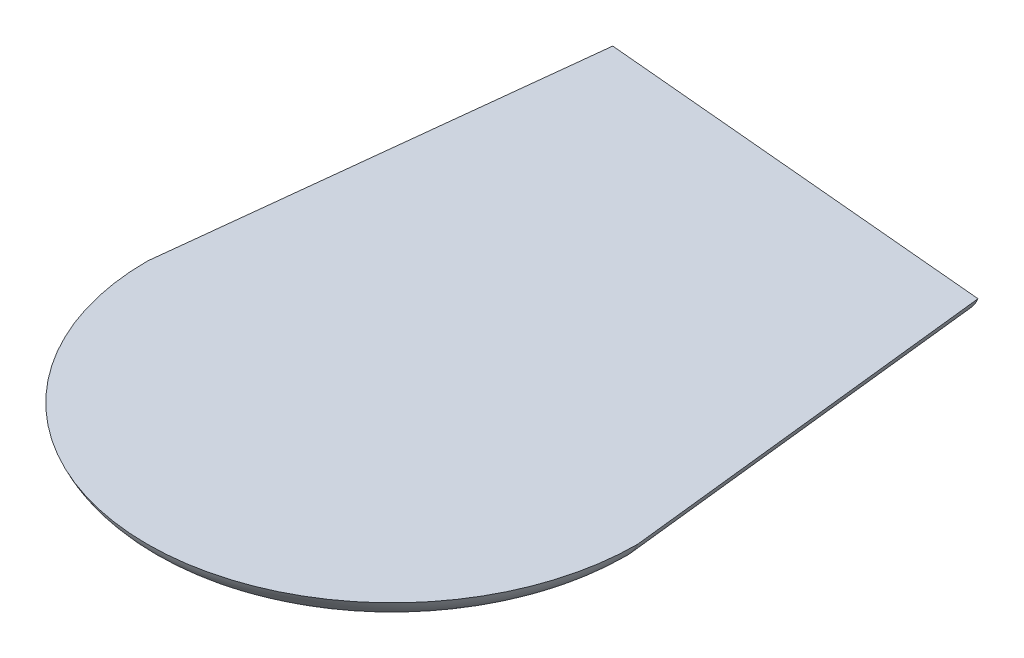
ISO-10303-21;
HEADER;
FILE_DESCRIPTION(('STEP AP214'),'2;1');
FILE_NAME('part.step','',(''),(''),'','','');
FILE_SCHEMA(('AUTOMOTIVE_DESIGN { 1 0 10303 214 1 1 1 1 }'));
ENDSEC;
DATA;
#1=APPLICATION_CONTEXT('core data for automotive mechanical design processes');
#2=APPLICATION_PROTOCOL_DEFINITION('international standard','automotive_design',2000,#1);
#3=PRODUCT_CONTEXT('',#1,'mechanical');
#4=PRODUCT('Part','Part','',(#3));
#5=PRODUCT_RELATED_PRODUCT_CATEGORY('part','',(#4));
#6=PRODUCT_DEFINITION_FORMATION('','',#4);
#7=PRODUCT_DEFINITION_CONTEXT('part definition',#1,'design');
#8=PRODUCT_DEFINITION('design','',#6,#7);
#9=PRODUCT_DEFINITION_SHAPE('','',#8);
#10=(LENGTH_UNIT() NAMED_UNIT(*) SI_UNIT(.MILLI.,.METRE.));
#11=(NAMED_UNIT(*) PLANE_ANGLE_UNIT() SI_UNIT($,.RADIAN.));
#12=(NAMED_UNIT(*) SI_UNIT($,.STERADIAN.) SOLID_ANGLE_UNIT());
#13=UNCERTAINTY_MEASURE_WITH_UNIT(LENGTH_MEASURE(1.E-05),#10,'distance_accuracy_value','');
#14=(GEOMETRIC_REPRESENTATION_CONTEXT(3) GLOBAL_UNCERTAINTY_ASSIGNED_CONTEXT((#13)) GLOBAL_UNIT_ASSIGNED_CONTEXT((#10,
#11,#12)) REPRESENTATION_CONTEXT('',''));
#15=CARTESIAN_POINT('',(0.,0.,0.));
#16=DIRECTION('',(0.,0.,1.));
#17=DIRECTION('',(1.,0.,0.));
#18=AXIS2_PLACEMENT_3D('',#15,#16,#17);
#19=CARTESIAN_POINT('',(4.23648736330622,-3.,-46.9807139742057));
#20=DIRECTION('',(-0.0898106216544804,0.,0.99595886071566));
#21=DIRECTION('',(0.99595886071566,0.,0.0898106216544804));
#22=AXIS2_PLACEMENT_3D('',#19,#20,#21);
#23=PLANE('',#22);
#24=DIRECTION('',(-0.99595886071566,0.,-0.0898106216544804));
#25=VECTOR('',#24,1.);
#26=CARTESIAN_POINT('',(4.23648736330622,-3.,-46.9807139742057));
#27=LINE('',#26,#25);
#28=CARTESIAN_POINT('',(-26.3780603527636,-3.,-49.7413817793752));
#29=VERTEX_POINT('',#28);
#30=CARTESIAN_POINT('',(-61.3628304151396,-3.,-52.8961345223583));
#31=VERTEX_POINT('',#30);
#32=EDGE_CURVE('E113',#29,#31,#27,.T.);
#33=ORIENTED_EDGE('',*,*,#32,.T.);
#34=CARTESIAN_POINT('',(-61.3628304151396,2.,-52.8961345223583));
#35=DIRECTION('',(0.0898106216544804,0.,-0.99595886071566));
#36=DIRECTION('',(-0.99595886071566,0.,-0.0898106216544804));
#37=AXIS2_PLACEMENT_3D('',#34,#35,#36);
#38=ELLIPSE('',#37,5.00105458418158,5.);
#39=CARTESIAN_POINT('',(-65.9278499198665,0.,-53.3077853000719));
#40=VERTEX_POINT('',#39);
#41=EDGE_CURVE('E60',#40,#31,#38,.F.);
#42=ORIENTED_EDGE('',*,*,#41,.F.);
#43=DIRECTION('',(-0.99595886071566,0.,-0.0898106216544804));
#44=VECTOR('',#43,1.);
#45=CARTESIAN_POINT('',(4.23648736330622,0.,-46.9807139742057));
#46=LINE('',#45,#44);
#47=CARTESIAN_POINT('',(-21.7207974794711,0.,-49.321412952994));
#48=VERTEX_POINT('',#47);
#49=EDGE_CURVE('E108',#48,#40,#46,.T.);
#50=ORIENTED_EDGE('',*,*,#49,.F.);
#51=CARTESIAN_POINT('',(-26.3780603527636,2.,-49.7413817793752));
#52=DIRECTION('',(0.0898106216544804,0.,-0.99595886071566));
#53=DIRECTION('',(-0.99595886071566,0.,-0.0898106216544804));
#54=AXIS2_PLACEMENT_3D('',#51,#52,#53);
#55=ELLIPSE('',#54,5.10210872442078,5.);
#56=EDGE_CURVE('E11',#29,#48,#55,.F.);
#57=ORIENTED_EDGE('',*,*,#56,.F.);
#58=EDGE_LOOP('',(#33,#42,#50,#57));
#59=FACE_BOUND('',#58,.T.);
#60=ADVANCED_FACE('F44',(#59),#23,.F.);
#61=CARTESIAN_POINT('',(0.,-3.,0.));
#62=DIRECTION('',(0.,-1.,0.));
#63=DIRECTION('',(0.,0.,1.));
#64=AXIS2_PLACEMENT_3D('',#61,#62,#63);
#65=PLANE('',#64);
#66=CARTESIAN_POINT('',(-44.0454082026318,-3.,-7.17046552061219));
#67=DIRECTION('',(0.,1.,0.));
#68=DIRECTION('',(0.,0.,1.));
#69=AXIS2_PLACEMENT_3D('',#66,#67,#68);
#70=CIRCLE('',#69,22.4174243050442);
#71=CARTESIAN_POINT('',(-66.461530220432,-3.,-6.92883324735814));
#72=VERTEX_POINT('',#71);
#73=CARTESIAN_POINT('',(-21.6292861848316,-3.,-6.92883324735813));
#74=VERTEX_POINT('',#73);
#75=EDGE_CURVE('E119',#72,#74,#70,.T.);
#76=ORIENTED_EDGE('',*,*,#75,.F.);
#77=DIRECTION('',(0.110244038447532,0.,-0.993904548730299));
#78=VECTOR('',#77,1.);
#79=CARTESIAN_POINT('',(-66.4907653745143,-3.,-6.66526386950875));
#80=LINE('',#79,#78);
#81=EDGE_CURVE('E96',#31,#72,#80,.F.);
#82=ORIENTED_EDGE('',*,*,#81,.F.);
#83=ORIENTED_EDGE('',*,*,#32,.F.);
#84=DIRECTION('',(0.110244038447532,0.,0.993904548730299));
#85=VECTOR('',#84,1.);
#86=CARTESIAN_POINT('',(-26.2754403075886,-3.,-48.8162113018905));
#87=LINE('',#86,#85);
#88=EDGE_CURVE('E124',#74,#29,#87,.F.);
#89=ORIENTED_EDGE('',*,*,#88,.F.);
#90=EDGE_LOOP('',(#76,#82,#83,#89));
#91=FACE_BOUND('',#90,.T.);
#92=ADVANCED_FACE('F141',(#91),#65,.T.);
#93=CARTESIAN_POINT('',(0.,0.,0.));
#94=DIRECTION('',(0.,-1.,0.));
#95=DIRECTION('',(0.,0.,1.));
#96=AXIS2_PLACEMENT_3D('',#93,#94,#95);
#97=PLANE('',#96);
#98=DIRECTION('',(-0.110244038447532,0.,0.993904548730299));
#99=VECTOR('',#98,1.);
#100=CARTESIAN_POINT('',(-70.967622829591,0.,-7.87173914210387));
#101=LINE('',#100,#99);
#102=CARTESIAN_POINT('',(-71.0454082026318,0.,-7.17046552061218));
#103=VERTEX_POINT('',#102);
#104=EDGE_CURVE('E94',#40,#103,#101,.T.);
#105=ORIENTED_EDGE('',*,*,#104,.T.);
#106=CARTESIAN_POINT('',(-44.0454082026318,0.,-7.17046552061219));
#107=DIRECTION('',(0.,1.,0.));
#108=DIRECTION('',(0.,0.,1.));
#109=AXIS2_PLACEMENT_3D('',#106,#107,#108);
#110=CIRCLE('',#109,27.);
#111=CARTESIAN_POINT('',(-17.0454082026318,0.,-7.17046552061219));
#112=VERTEX_POINT('',#111);
#113=EDGE_CURVE('E100',#103,#112,#110,.T.);
#114=ORIENTED_EDGE('',*,*,#113,.T.);
#115=DIRECTION('',(-0.110244038447532,0.,-0.993904548730299));
#116=VECTOR('',#115,1.);
#117=CARTESIAN_POINT('',(-16.0525599908042,0.,1.78055231065025));
#118=LINE('',#117,#116);
#119=EDGE_CURVE('E104',#112,#48,#118,.T.);
#120=ORIENTED_EDGE('',*,*,#119,.T.);
#121=ORIENTED_EDGE('',*,*,#49,.T.);
#122=EDGE_LOOP('',(#105,#114,#120,#121));
#123=FACE_BOUND('',#122,.T.);
#124=ADVANCED_FACE('F106',(#123),#97,.F.);
#125=CARTESIAN_POINT('',(-66.4129800014735,2.,-7.36653749100043));
#126=DIRECTION('',(-0.110244038447532,0.,0.993904548730299));
#127=DIRECTION('',(0.993904548730299,0.,0.110244038447532));
#128=AXIS2_PLACEMENT_3D('',#125,#126,#127);
#129=CYLINDRICAL_SURFACE('',#128,5.);
#130=ORIENTED_EDGE('',*,*,#41,.T.);
#131=ORIENTED_EDGE('',*,*,#81,.T.);
#132=CARTESIAN_POINT('',(-71.0454082026318,0.,-7.17046552061218));
#133=CARTESIAN_POINT('',(-70.9891632545754,-0.128911410572629,-7.1673558438904));
#134=CARTESIAN_POINT('',(-70.9274551335817,-0.255428588502961,-7.16394870861434));
#135=CARTESIAN_POINT('',(-70.7936175114508,-0.502799687587828,-7.15657422599523));
#136=CARTESIAN_POINT('',(-70.7214885719832,-0.623653913504012,-7.15260690884558));
#137=CARTESIAN_POINT('',(-70.567390343747,-0.858712956836937,-7.14415093749269));
#138=CARTESIAN_POINT('',(-70.4854316339903,-0.972924729817045,-7.13966284392659));
#139=CARTESIAN_POINT('',(-70.312203368848,-1.19403029017282,-7.13020209584261));
#140=CARTESIAN_POINT('',(-70.2209339307313,-1.30092416968931,-7.12522944742776));
#141=CARTESIAN_POINT('',(-70.0297148531681,-1.50665867667337,-7.11484227694856));
#142=CARTESIAN_POINT('',(-69.9297635476081,-1.60549775128007,-7.10942767008124));
#143=CARTESIAN_POINT('',(-69.7218721494841,-1.79443471057692,-7.09820277641206));
#144=CARTESIAN_POINT('',(-69.6139292909746,-1.88452954364142,-7.09239235267066));
#145=CARTESIAN_POINT('',(-69.390843920622,-2.0553110758346,-7.08042723733761));
#146=CARTESIAN_POINT('',(-69.2757007624269,-2.13599692847612,-7.07427251484442));
#147=CARTESIAN_POINT('',(-69.0390422423158,-2.28738300669751,-7.06167191816622));
#148=CARTESIAN_POINT('',(-68.9175268694161,-2.3580832150644,-7.05522604347934));
#149=CARTESIAN_POINT('',(-68.6687540490963,-2.48912371985861,-7.04208525356119));
#150=CARTESIAN_POINT('',(-68.5414862670528,-2.54944435206802,-7.0353898942343));
#151=CARTESIAN_POINT('',(-68.2823717329607,-2.65911969170678,-7.0218197791649));
#152=CARTESIAN_POINT('',(-68.1505265980881,-2.70847822735425,-7.01494508698975));
#153=CARTESIAN_POINT('',(-67.8832942266268,-2.79586407108927,-7.00107779067143));
#154=CARTESIAN_POINT('',(-67.7479108256271,-2.83390313733175,-6.99408531691108));
#155=CARTESIAN_POINT('',(-67.4744791830612,-2.89843962835979,-6.98003418507152));
#156=CARTESIAN_POINT('',(-67.3364321494718,-2.9249421622785,-6.97297555770719));
#157=CARTESIAN_POINT('',(-67.0823882473908,-2.96271149699411,-6.96005472194234));
#158=CARTESIAN_POINT('',(-66.9666585568858,-2.9758089228742,-6.95419438156215));
#159=CARTESIAN_POINT('',(-66.7346667509082,-2.99389470564459,-6.94250036028998));
#160=CARTESIAN_POINT('',(-66.6184053251805,-2.99889159497268,-6.93666665780918));
#161=CARTESIAN_POINT('',(-66.4886057213292,-2.9999451300382,-6.93018431123964));
#162=CARTESIAN_POINT('',(-66.4750677142916,-3.00000005399094,-6.92950857952413));
#163=CARTESIAN_POINT('',(-66.461530220432,-3.,-6.92883324735814));
#164=B_SPLINE_CURVE_WITH_KNOTS('',3,(#132,#133,#134,#135,#136,#137,#138,#139,#140,#141,#142,
#143,#144,#145,#146,#147,#148,#149,#150,#151,#152,#153,#154,#155,#156,#157,#158,#159,#160,#161,
#162,#163),.UNSPECIFIED.,.F.,.F.,(4,2,2,2,2,2,2,2,2,2,2,2,2,2,2,4),(0.,0.421915227899083,
0.843807723553923,1.26525017637344,1.68668732176364,2.10820552345114,2.52987030446837,
2.95157299170703,3.37327640585662,3.79577014985736,4.21811611643569,4.64002182520762,
5.06174049589293,5.41132645832418,5.76054395588727,5.80120835541687),.UNSPECIFIED.);
#165=EDGE_CURVE('E49',#72,#103,#164,.F.);
#166=ORIENTED_EDGE('',*,*,#165,.T.);
#167=ORIENTED_EDGE('',*,*,#104,.F.);
#168=EDGE_LOOP('',(#130,#131,#166,#167));
#169=FACE_BOUND('',#168,.T.);
#170=ADVANCED_FACE('F46',(#169),#129,.T.);
#171=CARTESIAN_POINT('',(-44.0454082026318,2.,-7.17046552061219));
#172=DIRECTION('',(0.,1.,0.));
#173=DIRECTION('',(0.,0.,-1.));
#174=AXIS2_PLACEMENT_3D('',#171,#172,#173);
#175=TOROIDAL_SURFACE('',#174,22.4174243050442,5.);
#176=ORIENTED_EDGE('',*,*,#165,.F.);
#177=ORIENTED_EDGE('',*,*,#75,.T.);
#178=CARTESIAN_POINT('',(-17.0454082026318,0.,-7.17046552061219));
#179=CARTESIAN_POINT('',(-17.1016531506882,-0.128911410572633,-7.16735584389039));
#180=CARTESIAN_POINT('',(-17.163361271682,-0.255428588502966,-7.16394870861432));
#181=CARTESIAN_POINT('',(-17.2971988938129,-0.502799687587839,-7.15657422599522));
#182=CARTESIAN_POINT('',(-17.3693278332804,-0.623653913504025,-7.15260690884557));
#183=CARTESIAN_POINT('',(-17.5234260615166,-0.858712956836947,-7.14415093749268));
#184=CARTESIAN_POINT('',(-17.6053847712733,-0.97292472981705,-7.13966284392657));
#185=CARTESIAN_POINT('',(-17.7786130364156,-1.19403029017281,-7.13020209584259));
#186=CARTESIAN_POINT('',(-17.8698824745323,-1.30092416968931,-7.12522944742774));
#187=CARTESIAN_POINT('',(-18.0611015520956,-1.50665867667336,-7.11484227694854));
#188=CARTESIAN_POINT('',(-18.1610528576555,-1.60549775128006,-7.10942767008123));
#189=CARTESIAN_POINT('',(-18.3689442557795,-1.7944347105769,-7.09820277641204));
#190=CARTESIAN_POINT('',(-18.476887114289,-1.8845295436414,-7.09239235267063));
#191=CARTESIAN_POINT('',(-18.6999724846416,-2.05531107583458,-7.08042723733758));
#192=CARTESIAN_POINT('',(-18.8151156428367,-2.1359969284761,-7.0742725148444));
#193=CARTESIAN_POINT('',(-19.0517741629477,-2.2873830066975,-7.06167191816618));
#194=CARTESIAN_POINT('',(-19.1732895358475,-2.35808321506439,-7.0552260434793));
#195=CARTESIAN_POINT('',(-19.4220623561673,-2.48912371985861,-7.04208525356117));
#196=CARTESIAN_POINT('',(-19.5493301382108,-2.54944435206801,-7.03538989423432));
#197=CARTESIAN_POINT('',(-19.8084446723029,-2.65911969170678,-7.02181977916489));
#198=CARTESIAN_POINT('',(-19.9402898071755,-2.70847822735426,-7.01494508698968));
#199=CARTESIAN_POINT('',(-20.2075221786368,-2.79586407108927,-7.00107779067135));
#200=CARTESIAN_POINT('',(-20.3429055796365,-2.83390313733175,-6.99408531691105));
#201=CARTESIAN_POINT('',(-20.6163372222024,-2.89843962835979,-6.98003418507151));
#202=CARTESIAN_POINT('',(-20.7543842557919,-2.92494216227849,-6.97297555770714));
#203=CARTESIAN_POINT('',(-21.0084281578728,-2.96271149699411,-6.96005472194232));
#204=CARTESIAN_POINT('',(-21.1241578483778,-2.97580892287422,-6.95419438156217));
#205=CARTESIAN_POINT('',(-21.3561496543553,-2.99389470564457,-6.94250036028991));
#206=CARTESIAN_POINT('',(-21.4724110800831,-2.9988915949726,-6.93666665780899));
#207=CARTESIAN_POINT('',(-21.6022106839344,-2.99994513003821,-6.9301843112396));
#208=CARTESIAN_POINT('',(-21.615748690972,-3.00000005399095,-6.92950857952411));
#209=CARTESIAN_POINT('',(-21.6292861848316,-3.00000000000003,-6.92883324735815));
#210=B_SPLINE_CURVE_WITH_KNOTS('',3,(#178,#179,#180,#181,#182,#183,#184,#185,#186,#187,#188,
#189,#190,#191,#192,#193,#194,#195,#196,#197,#198,#199,#200,#201,#202,#203,#204,#205,#206,#207,
#208,#209),.UNSPECIFIED.,.F.,.F.,(4,2,2,2,2,2,2,2,2,2,2,2,2,2,2,4),(0.,0.421915227899092,
0.843807723553943,1.26525017637345,1.68668732176363,2.10820552345112,2.52987030446834,
2.951572991707,3.3732764058566,3.79577014985736,4.21811611643571,4.64002182520762,
5.06174049589293,5.41132645832416,5.76054395588727,5.80120835541687),.UNSPECIFIED.);
#211=EDGE_CURVE('E68',#74,#112,#210,.F.);
#212=ORIENTED_EDGE('',*,*,#211,.T.);
#213=ORIENTED_EDGE('',*,*,#113,.F.);
#214=EDGE_LOOP('',(#176,#177,#212,#213));
#215=FACE_BOUND('',#214,.T.);
#216=ADVANCED_FACE('F101',(#215),#175,.T.);
#217=CARTESIAN_POINT('',(-20.6072028189217,2.,2.28575396175369));
#218=DIRECTION('',(-0.110244038447532,0.,-0.993904548730299));
#219=DIRECTION('',(-0.993904548730299,0.,0.110244038447532));
#220=AXIS2_PLACEMENT_3D('',#217,#218,#219);
#221=CYLINDRICAL_SURFACE('',#220,5.);
#222=ORIENTED_EDGE('',*,*,#211,.F.);
#223=ORIENTED_EDGE('',*,*,#88,.T.);
#224=ORIENTED_EDGE('',*,*,#56,.T.);
#225=ORIENTED_EDGE('',*,*,#119,.F.);
#226=EDGE_LOOP('',(#222,#223,#224,#225));
#227=FACE_BOUND('',#226,.T.);
#228=ADVANCED_FACE('F133',(#227),#221,.T.);
#229=CLOSED_SHELL('',(#60,#92,#124,#170,#216,#228));
#230=MANIFOLD_SOLID_BREP('B2',#229);
#231=ADVANCED_BREP_SHAPE_REPRESENTATION('',(#18,#230),#14);
#232=SHAPE_DEFINITION_REPRESENTATION(#9,#231);
ENDSEC;
END-ISO-10303-21;
